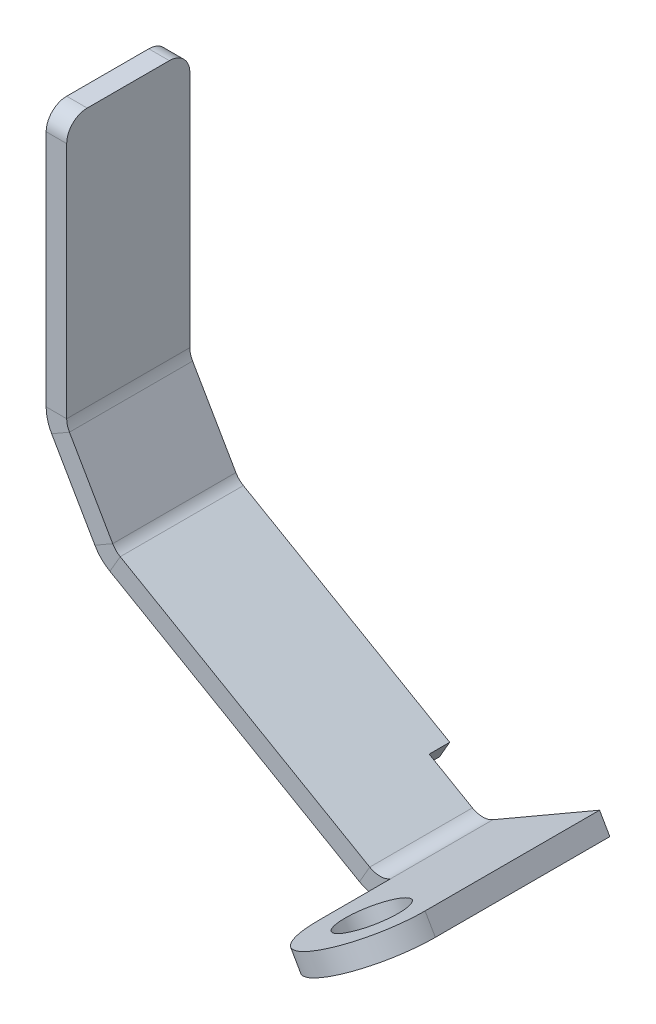
ISO-10303-21;
HEADER;
FILE_DESCRIPTION(('STEP AP214'),'2;1');
FILE_NAME('part.step','',(''),(''),'','','');
FILE_SCHEMA(('AUTOMOTIVE_DESIGN { 1 0 10303 214 1 1 1 1 }'));
ENDSEC;
DATA;
#1=APPLICATION_CONTEXT('core data for automotive mechanical design processes');
#2=APPLICATION_PROTOCOL_DEFINITION('international standard','automotive_design',2000,#1);
#3=PRODUCT_CONTEXT('',#1,'mechanical');
#4=PRODUCT('Part','Part','',(#3));
#5=PRODUCT_RELATED_PRODUCT_CATEGORY('part','',(#4));
#6=PRODUCT_DEFINITION_FORMATION('','',#4);
#7=PRODUCT_DEFINITION_CONTEXT('part definition',#1,'design');
#8=PRODUCT_DEFINITION('design','',#6,#7);
#9=PRODUCT_DEFINITION_SHAPE('','',#8);
#10=(LENGTH_UNIT() NAMED_UNIT(*) SI_UNIT(.MILLI.,.METRE.));
#11=(NAMED_UNIT(*) PLANE_ANGLE_UNIT() SI_UNIT($,.RADIAN.));
#12=(NAMED_UNIT(*) SI_UNIT($,.STERADIAN.) SOLID_ANGLE_UNIT());
#13=UNCERTAINTY_MEASURE_WITH_UNIT(LENGTH_MEASURE(1.E-05),#10,'distance_accuracy_value','');
#14=(GEOMETRIC_REPRESENTATION_CONTEXT(3) GLOBAL_UNCERTAINTY_ASSIGNED_CONTEXT((#13)) GLOBAL_UNIT_ASSIGNED_CONTEXT((#10,
#11,#12)) REPRESENTATION_CONTEXT('',''));
#15=CARTESIAN_POINT('',(0.,0.,0.));
#16=DIRECTION('',(0.,0.,1.));
#17=DIRECTION('',(1.,0.,0.));
#18=AXIS2_PLACEMENT_3D('',#15,#16,#17);
#19=CARTESIAN_POINT('',(0.462499551221927,17.4022268919688,0.999999999999999));
#20=DIRECTION('',(0.,0.,1.));
#21=DIRECTION('',(-0.866025403784438,0.500000000000001,0.));
#22=AXIS2_PLACEMENT_3D('',#19,#20,#21);
#23=PLANE('',#22);
#24=DIRECTION('',(0.866025403784438,-0.500000000000001,0.));
#25=VECTOR('',#24,1.);
#26=CARTESIAN_POINT('',(-0.037500448778074,16.5362014881843,0.999999999999999));
#27=LINE('',#26,#25);
#28=CARTESIAN_POINT('',(12.5198679060963,9.28620148818432,1.));
#29=VERTEX_POINT('',#28);
#30=CARTESIAN_POINT('',(14.6236199980584,8.07159965158177,1.));
#31=VERTEX_POINT('',#30);
#32=EDGE_CURVE('E239',#29,#31,#27,.T.);
#33=ORIENTED_EDGE('',*,*,#32,.F.);
#34=DIRECTION('',(-0.500000000000001,-0.866025403784438,0.));
#35=VECTOR('',#34,1.);
#36=CARTESIAN_POINT('',(13.0198679060963,10.1522268919688,1.));
#37=LINE('',#36,#35);
#38=CARTESIAN_POINT('',(13.0198679060963,10.1522268919688,1.));
#39=VERTEX_POINT('',#38);
#40=EDGE_CURVE('E223',#39,#29,#37,.T.);
#41=ORIENTED_EDGE('',*,*,#40,.F.);
#42=DIRECTION('',(0.866025403784438,-0.500000000000001,0.));
#43=VECTOR('',#42,1.);
#44=CARTESIAN_POINT('',(0.462499551221927,17.4022268919688,0.999999999999999));
#45=LINE('',#44,#43);
#46=CARTESIAN_POINT('',(15.1236199980584,8.93762505536621,0.999999999999999));
#47=VERTEX_POINT('',#46);
#48=EDGE_CURVE('E51',#39,#47,#45,.T.);
#49=ORIENTED_EDGE('',*,*,#48,.T.);
#50=DIRECTION('',(0.500000000000001,0.866025403784438,0.));
#51=VECTOR('',#50,1.);
#52=CARTESIAN_POINT('',(15.1236199980584,8.93762505536621,1.));
#53=LINE('',#52,#51);
#54=EDGE_CURVE('E213',#31,#47,#53,.T.);
#55=ORIENTED_EDGE('',*,*,#54,.F.);
#56=EDGE_LOOP('',(#33,#41,#49,#55));
#57=FACE_BOUND('',#56,.T.);
#58=ADVANCED_FACE('F47',(#57),#23,.F.);
#59=CARTESIAN_POINT('',(-0.037500448778074,16.5362014881843,0.));
#60=DIRECTION('',(0.500000000000001,0.866025403784438,0.));
#61=DIRECTION('',(0.,0.,-1.));
#62=AXIS2_PLACEMENT_3D('',#59,#60,#61);
#63=PLANE('',#62);
#64=DIRECTION('',(0.866025403784438,-0.500000000000001,0.));
#65=VECTOR('',#64,1.);
#66=CARTESIAN_POINT('',(-0.037500448778074,16.5362014881843,6.));
#67=LINE('',#66,#65);
#68=CARTESIAN_POINT('',(2.46765044147694,15.089851947335,6.));
#69=VERTEX_POINT('',#68);
#70=CARTESIAN_POINT('',(14.6236199980584,8.07159965158177,6.));
#71=VERTEX_POINT('',#70);
#72=EDGE_CURVE('E348',#69,#71,#67,.T.);
#73=ORIENTED_EDGE('',*,*,#72,.F.);
#74=DIRECTION('',(0.,0.,1.));
#75=VECTOR('',#74,1.);
#76=CARTESIAN_POINT('',(2.46765044147694,15.089851947335,0.));
#77=LINE('',#76,#75);
#78=CARTESIAN_POINT('',(2.46765044147694,15.089851947335,0.));
#79=VERTEX_POINT('',#78);
#80=EDGE_CURVE('E350',#79,#69,#77,.T.);
#81=ORIENTED_EDGE('',*,*,#80,.F.);
#82=DIRECTION('',(0.866025403784438,-0.500000000000001,0.));
#83=VECTOR('',#82,1.);
#84=CARTESIAN_POINT('',(-0.037500448778074,16.5362014881843,0.));
#85=LINE('',#84,#83);
#86=CARTESIAN_POINT('',(12.5198679060963,9.28620148818432,0.));
#87=VERTEX_POINT('',#86);
#88=EDGE_CURVE('E227',#79,#87,#85,.T.);
#89=ORIENTED_EDGE('',*,*,#88,.T.);
#90=DIRECTION('',(0.,0.,-1.));
#91=VECTOR('',#90,1.);
#92=CARTESIAN_POINT('',(12.5198679060963,9.28620148818432,0.));
#93=LINE('',#92,#91);
#94=EDGE_CURVE('E347',#29,#87,#93,.T.);
#95=ORIENTED_EDGE('',*,*,#94,.F.);
#96=ORIENTED_EDGE('',*,*,#32,.T.);
#97=DIRECTION('',(0.,0.,-1.));
#98=VECTOR('',#97,1.);
#99=CARTESIAN_POINT('',(14.6236199980584,8.07159965158177,0.));
#100=LINE('',#99,#98);
#101=EDGE_CURVE('E56',#71,#31,#100,.T.);
#102=ORIENTED_EDGE('',*,*,#101,.F.);
#103=EDGE_LOOP('',(#73,#81,#89,#95,#96,#102));
#104=FACE_BOUND('',#103,.T.);
#105=ADVANCED_FACE('F354',(#104),#63,.F.);
#106=CARTESIAN_POINT('',(1.54797457854187,18.146878883571,6.));
#107=DIRECTION('',(0.,0.,1.));
#108=DIRECTION('',(-0.499999999999998,0.86602540378444,0.));
#109=AXIS2_PLACEMENT_3D('',#106,#107,#108);
#110=PLANE('',#109);
#111=DIRECTION('',(0.499999999999998,-0.86602540378444,0.));
#112=VECTOR('',#111,1.);
#113=CARTESIAN_POINT('',(1.54797457854187,18.146878883571,6.));
#114=LINE('',#113,#112);
#115=CARTESIAN_POINT('',(0.494324119391233,19.9718550122382,6.));
#116=VERTEX_POINT('',#115);
#117=CARTESIAN_POINT('',(2.6016250376925,16.3219027549039,6.));
#118=VERTEX_POINT('',#117);
#119=EDGE_CURVE('E315',#116,#118,#114,.T.);
#120=ORIENTED_EDGE('',*,*,#119,.F.);
#121=DIRECTION('',(-0.86602540378444,-0.499999999999998,0.));
#122=VECTOR('',#121,1.);
#123=CARTESIAN_POINT('',(0.494324119391233,19.9718550122382,6.));
#124=LINE('',#123,#122);
#125=CARTESIAN_POINT('',(-0.371701284393207,19.4718550122382,6.));
#126=VERTEX_POINT('',#125);
#127=EDGE_CURVE('E314',#116,#126,#124,.T.);
#128=ORIENTED_EDGE('',*,*,#127,.T.);
#129=DIRECTION('',(0.499999999999998,-0.86602540378444,0.));
#130=VECTOR('',#129,1.);
#131=CARTESIAN_POINT('',(0.681949174757427,17.646878883571,6.));
#132=LINE('',#131,#130);
#133=CARTESIAN_POINT('',(1.73559963390806,15.8219027549039,6.));
#134=VERTEX_POINT('',#133);
#135=EDGE_CURVE('E338',#126,#134,#132,.T.);
#136=ORIENTED_EDGE('',*,*,#135,.T.);
#137=DIRECTION('',(-0.86602540378444,-0.499999999999998,0.));
#138=VECTOR('',#137,1.);
#139=CARTESIAN_POINT('',(2.6016250376925,16.3219027549039,6.));
#140=LINE('',#139,#138);
#141=EDGE_CURVE('E214',#118,#134,#140,.T.);
#142=ORIENTED_EDGE('',*,*,#141,.F.);
#143=EDGE_LOOP('',(#120,#128,#136,#142));
#144=FACE_BOUND('',#143,.T.);
#145=ADVANCED_FACE('F394',(#144),#110,.T.);
#146=CARTESIAN_POINT('',(1.54797457854187,18.146878883571,0.));
#147=DIRECTION('',(0.86602540378444,0.499999999999998,0.));
#148=DIRECTION('',(0.,0.,-1.));
#149=AXIS2_PLACEMENT_3D('',#146,#147,#148);
#150=PLANE('',#149);
#151=DIRECTION('',(0.499999999999998,-0.86602540378444,0.));
#152=VECTOR('',#151,1.);
#153=CARTESIAN_POINT('',(1.54797457854187,18.146878883571,0.));
#154=LINE('',#153,#152);
#155=CARTESIAN_POINT('',(0.494324119391233,19.9718550122382,0.));
#156=VERTEX_POINT('',#155);
#157=CARTESIAN_POINT('',(2.6016250376925,16.3219027549039,0.));
#158=VERTEX_POINT('',#157);
#159=EDGE_CURVE('E337',#156,#158,#154,.T.);
#160=ORIENTED_EDGE('',*,*,#159,.F.);
#161=DIRECTION('',(0.,0.,1.));
#162=VECTOR('',#161,1.);
#163=CARTESIAN_POINT('',(0.494324119391233,19.9718550122382,0.));
#164=LINE('',#163,#162);
#165=EDGE_CURVE('E311',#156,#116,#164,.T.);
#166=ORIENTED_EDGE('',*,*,#165,.T.);
#167=ORIENTED_EDGE('',*,*,#119,.T.);
#168=DIRECTION('',(0.,0.,1.));
#169=VECTOR('',#168,1.);
#170=CARTESIAN_POINT('',(2.6016250376925,16.3219027549039,0.));
#171=LINE('',#170,#169);
#172=EDGE_CURVE('E324',#158,#118,#171,.T.);
#173=ORIENTED_EDGE('',*,*,#172,.F.);
#174=EDGE_LOOP('',(#160,#166,#167,#173));
#175=FACE_BOUND('',#174,.T.);
#176=ADVANCED_FACE('F377',(#175),#150,.T.);
#177=CARTESIAN_POINT('',(0.681949174757427,17.646878883571,0.));
#178=DIRECTION('',(0.86602540378444,0.499999999999998,0.));
#179=DIRECTION('',(0.,0.,-1.));
#180=AXIS2_PLACEMENT_3D('',#177,#178,#179);
#181=PLANE('',#180);
#182=DIRECTION('',(0.,0.,1.));
#183=VECTOR('',#182,1.);
#184=CARTESIAN_POINT('',(1.73559963390806,15.8219027549039,0.));
#185=LINE('',#184,#183);
#186=CARTESIAN_POINT('',(1.73559963390806,15.8219027549039,0.));
#187=VERTEX_POINT('',#186);
#188=EDGE_CURVE('E330',#187,#134,#185,.T.);
#189=ORIENTED_EDGE('',*,*,#188,.T.);
#190=ORIENTED_EDGE('',*,*,#135,.F.);
#191=DIRECTION('',(0.,0.,1.));
#192=VECTOR('',#191,1.);
#193=CARTESIAN_POINT('',(-0.371701284393207,19.4718550122382,0.));
#194=LINE('',#193,#192);
#195=CARTESIAN_POINT('',(-0.371701284393207,19.4718550122382,0.));
#196=VERTEX_POINT('',#195);
#197=EDGE_CURVE('E318',#196,#126,#194,.T.);
#198=ORIENTED_EDGE('',*,*,#197,.F.);
#199=DIRECTION('',(0.499999999999998,-0.86602540378444,0.));
#200=VECTOR('',#199,1.);
#201=CARTESIAN_POINT('',(0.681949174757427,17.646878883571,0.));
#202=LINE('',#201,#200);
#203=EDGE_CURVE('E307',#196,#187,#202,.T.);
#204=ORIENTED_EDGE('',*,*,#203,.T.);
#205=EDGE_LOOP('',(#189,#190,#198,#204));
#206=FACE_BOUND('',#205,.T.);
#207=ADVANCED_FACE('F452',(#206),#181,.F.);
#208=CARTESIAN_POINT('',(1.54797457854187,18.146878883571,0.));
#209=DIRECTION('',(0.,0.,1.));
#210=DIRECTION('',(-0.499999999999998,0.86602540378444,0.));
#211=AXIS2_PLACEMENT_3D('',#208,#209,#210);
#212=PLANE('',#211);
#213=DIRECTION('',(-0.86602540378444,-0.499999999999998,0.));
#214=VECTOR('',#213,1.);
#215=CARTESIAN_POINT('',(2.6016250376925,16.3219027549039,0.));
#216=LINE('',#215,#214);
#217=EDGE_CURVE('E327',#158,#187,#216,.T.);
#218=ORIENTED_EDGE('',*,*,#217,.T.);
#219=ORIENTED_EDGE('',*,*,#203,.F.);
#220=DIRECTION('',(-0.86602540378444,-0.499999999999998,0.));
#221=VECTOR('',#220,1.);
#222=CARTESIAN_POINT('',(0.494324119391233,19.9718550122382,0.));
#223=LINE('',#222,#221);
#224=EDGE_CURVE('E321',#156,#196,#223,.T.);
#225=ORIENTED_EDGE('',*,*,#224,.F.);
#226=ORIENTED_EDGE('',*,*,#159,.T.);
#227=EDGE_LOOP('',(#218,#219,#225,#226));
#228=FACE_BOUND('',#227,.T.);
#229=ADVANCED_FACE('F381',(#228),#212,.F.);
#230=CARTESIAN_POINT('',(1.36034952317567,20.4718550122382,0.));
#231=DIRECTION('',(0.,0.,1.));
#232=DIRECTION('',(-0.499999999999998,0.86602540378444,0.));
#233=AXIS2_PLACEMENT_3D('',#230,#231,#232);
#234=PLANE('',#233);
#235=DIRECTION('',(-1.,0.,0.));
#236=VECTOR('',#235,1.);
#237=CARTESIAN_POINT('',(0.360349523175673,20.4718550122382,0.));
#238=LINE('',#237,#236);
#239=CARTESIAN_POINT('',(0.360349523175673,20.4718550122382,0.));
#240=VERTEX_POINT('',#239);
#241=CARTESIAN_POINT('',(-0.639650476824327,20.4718550122382,0.));
#242=VERTEX_POINT('',#241);
#243=EDGE_CURVE('E251',#240,#242,#238,.T.);
#244=ORIENTED_EDGE('',*,*,#243,.F.);
#245=CARTESIAN_POINT('',(1.36034952317567,20.4718550122382,0.));
#246=DIRECTION('',(0.,0.,1.));
#247=DIRECTION('',(0.499999999999998,-0.86602540378444,0.));
#248=AXIS2_PLACEMENT_3D('',#245,#246,#247);
#249=CIRCLE('',#248,1.);
#250=EDGE_CURVE('E301',#240,#156,#249,.T.);
#251=ORIENTED_EDGE('',*,*,#250,.T.);
#252=ORIENTED_EDGE('',*,*,#224,.T.);
#253=CARTESIAN_POINT('',(1.36034952317567,20.4718550122382,0.));
#254=DIRECTION('',(0.,0.,1.));
#255=DIRECTION('',(0.499999999999998,-0.86602540378444,0.));
#256=AXIS2_PLACEMENT_3D('',#253,#254,#255);
#257=CIRCLE('',#256,2.);
#258=EDGE_CURVE('E257',#242,#196,#257,.T.);
#259=ORIENTED_EDGE('',*,*,#258,.F.);
#260=EDGE_LOOP('',(#244,#251,#252,#259));
#261=FACE_BOUND('',#260,.T.);
#262=ADVANCED_FACE('F456',(#261),#234,.F.);
#263=CARTESIAN_POINT('',(1.36034952317567,20.4718550122382,6.));
#264=DIRECTION('',(0.,0.,-1.));
#265=DIRECTION('',(0.499999999999998,-0.86602540378444,0.));
#266=AXIS2_PLACEMENT_3D('',#263,#264,#265);
#267=PLANE('',#266);
#268=CARTESIAN_POINT('',(1.36034952317567,20.4718550122382,6.));
#269=DIRECTION('',(0.,0.,1.));
#270=DIRECTION('',(0.499999999999998,-0.86602540378444,0.));
#271=AXIS2_PLACEMENT_3D('',#268,#269,#270);
#272=CIRCLE('',#271,2.);
#273=CARTESIAN_POINT('',(-0.639650476824327,20.4718550122382,6.));
#274=VERTEX_POINT('',#273);
#275=EDGE_CURVE('E304',#126,#274,#272,.F.);
#276=ORIENTED_EDGE('',*,*,#275,.F.);
#277=ORIENTED_EDGE('',*,*,#127,.F.);
#278=CARTESIAN_POINT('',(1.36034952317567,20.4718550122382,6.));
#279=DIRECTION('',(0.,0.,-1.));
#280=DIRECTION('',(0.499999999999998,-0.86602540378444,0.));
#281=AXIS2_PLACEMENT_3D('',#278,#279,#280);
#282=CIRCLE('',#281,1.);
#283=CARTESIAN_POINT('',(0.360349523175673,20.4718550122382,6.));
#284=VERTEX_POINT('',#283);
#285=EDGE_CURVE('E303',#116,#284,#282,.T.);
#286=ORIENTED_EDGE('',*,*,#285,.T.);
#287=DIRECTION('',(-1.,0.,0.));
#288=VECTOR('',#287,1.);
#289=CARTESIAN_POINT('',(0.360349523175673,20.4718550122382,6.));
#290=LINE('',#289,#288);
#291=EDGE_CURVE('E263',#284,#274,#290,.T.);
#292=ORIENTED_EDGE('',*,*,#291,.T.);
#293=EDGE_LOOP('',(#276,#277,#286,#292));
#294=FACE_BOUND('',#293,.T.);
#295=ADVANCED_FACE('F392',(#294),#267,.F.);
#296=CARTESIAN_POINT('',(1.36034952317567,20.4718550122382,9.13325772123332));
#297=DIRECTION('',(0.,0.,-1.));
#298=DIRECTION('',(0.499999999999998,-0.86602540378444,0.));
#299=AXIS2_PLACEMENT_3D('',#296,#297,#298);
#300=CYLINDRICAL_SURFACE('',#299,1.);
#301=ORIENTED_EDGE('',*,*,#165,.F.);
#302=ORIENTED_EDGE('',*,*,#250,.F.);
#303=DIRECTION('',(0.,0.,1.));
#304=VECTOR('',#303,1.);
#305=CARTESIAN_POINT('',(0.360349523175673,20.4718550122382,0.));
#306=LINE('',#305,#304);
#307=EDGE_CURVE('E275',#240,#284,#306,.T.);
#308=ORIENTED_EDGE('',*,*,#307,.T.);
#309=ORIENTED_EDGE('',*,*,#285,.F.);
#310=EDGE_LOOP('',(#301,#302,#308,#309));
#311=FACE_BOUND('',#310,.T.);
#312=ADVANCED_FACE('F388',(#311),#300,.F.);
#313=CARTESIAN_POINT('',(1.36034952317567,20.4718550122382,9.13325772123332));
#314=DIRECTION('',(0.,0.,-1.));
#315=DIRECTION('',(0.499999999999998,-0.86602540378444,0.));
#316=AXIS2_PLACEMENT_3D('',#313,#314,#315);
#317=CYLINDRICAL_SURFACE('',#316,2.);
#318=ORIENTED_EDGE('',*,*,#197,.T.);
#319=ORIENTED_EDGE('',*,*,#275,.T.);
#320=DIRECTION('',(0.,0.,1.));
#321=VECTOR('',#320,1.);
#322=CARTESIAN_POINT('',(-0.639650476824327,20.4718550122382,0.));
#323=LINE('',#322,#321);
#324=EDGE_CURVE('E296',#242,#274,#323,.T.);
#325=ORIENTED_EDGE('',*,*,#324,.F.);
#326=ORIENTED_EDGE('',*,*,#258,.T.);
#327=EDGE_LOOP('',(#318,#319,#325,#326));
#328=FACE_BOUND('',#327,.T.);
#329=ADVANCED_FACE('F454',(#328),#317,.T.);
#330=CARTESIAN_POINT('',(0.360349523175713,32.0791559305395,1.));
#331=DIRECTION('',(-1.,0.,0.));
#332=DIRECTION('',(0.,0.,1.));
#333=AXIS2_PLACEMENT_3D('',#330,#331,#332);
#334=CYLINDRICAL_SURFACE('',#333,1.);
#335=CARTESIAN_POINT('',(-0.639650476824287,32.0791559305395,1.));
#336=DIRECTION('',(-1.,0.,0.));
#337=DIRECTION('',(0.,0.,-1.));
#338=AXIS2_PLACEMENT_3D('',#335,#336,#337);
#339=CIRCLE('',#338,1.);
#340=CARTESIAN_POINT('',(-0.639650476824283,33.0791559305395,1.));
#341=VERTEX_POINT('',#340);
#342=CARTESIAN_POINT('',(-0.639650476824287,32.0791559305395,0.));
#343=VERTEX_POINT('',#342);
#344=EDGE_CURVE('E293',#341,#343,#339,.T.);
#345=ORIENTED_EDGE('',*,*,#344,.F.);
#346=DIRECTION('',(-1.,0.,0.));
#347=VECTOR('',#346,1.);
#348=CARTESIAN_POINT('',(0.360349523175717,33.0791559305395,1.));
#349=LINE('',#348,#347);
#350=CARTESIAN_POINT('',(0.360349523175717,33.0791559305395,1.));
#351=VERTEX_POINT('',#350);
#352=EDGE_CURVE('E290',#351,#341,#349,.T.);
#353=ORIENTED_EDGE('',*,*,#352,.F.);
#354=CARTESIAN_POINT('',(0.360349523175713,32.0791559305395,1.));
#355=DIRECTION('',(-1.,0.,0.));
#356=DIRECTION('',(0.,0.,-1.));
#357=AXIS2_PLACEMENT_3D('',#354,#355,#356);
#358=CIRCLE('',#357,1.);
#359=CARTESIAN_POINT('',(0.360349523175713,32.0791559305395,0.));
#360=VERTEX_POINT('',#359);
#361=EDGE_CURVE('E268',#351,#360,#358,.T.);
#362=ORIENTED_EDGE('',*,*,#361,.T.);
#363=DIRECTION('',(-1.,0.,0.));
#364=VECTOR('',#363,1.);
#365=CARTESIAN_POINT('',(0.360349523175713,32.0791559305395,0.));
#366=LINE('',#365,#364);
#367=EDGE_CURVE('E258',#360,#343,#366,.T.);
#368=ORIENTED_EDGE('',*,*,#367,.T.);
#369=EDGE_LOOP('',(#345,#353,#362,#368));
#370=FACE_BOUND('',#369,.T.);
#371=ADVANCED_FACE('F476',(#370),#334,.T.);
#372=CARTESIAN_POINT('',(0.360349523175717,33.0791559305395,0.));
#373=DIRECTION('',(0.,-1.,0.));
#374=DIRECTION('',(0.,0.,1.));
#375=AXIS2_PLACEMENT_3D('',#372,#373,#374);
#376=PLANE('',#375);
#377=DIRECTION('',(0.,0.,-1.));
#378=VECTOR('',#377,1.);
#379=CARTESIAN_POINT('',(-0.639650476824283,33.0791559305395,0.));
#380=LINE('',#379,#378);
#381=CARTESIAN_POINT('',(-0.639650476824283,33.0791559305395,5.));
#382=VERTEX_POINT('',#381);
#383=EDGE_CURVE('E288',#382,#341,#380,.T.);
#384=ORIENTED_EDGE('',*,*,#383,.F.);
#385=DIRECTION('',(-1.,0.,0.));
#386=VECTOR('',#385,1.);
#387=CARTESIAN_POINT('',(0.360349523175717,33.0791559305395,5.));
#388=LINE('',#387,#386);
#389=CARTESIAN_POINT('',(0.360349523175717,33.0791559305395,5.));
#390=VERTEX_POINT('',#389);
#391=EDGE_CURVE('E285',#390,#382,#388,.T.);
#392=ORIENTED_EDGE('',*,*,#391,.F.);
#393=DIRECTION('',(0.,0.,-1.));
#394=VECTOR('',#393,1.);
#395=CARTESIAN_POINT('',(0.360349523175717,33.0791559305395,0.));
#396=LINE('',#395,#394);
#397=EDGE_CURVE('E271',#390,#351,#396,.T.);
#398=ORIENTED_EDGE('',*,*,#397,.T.);
#399=ORIENTED_EDGE('',*,*,#352,.T.);
#400=EDGE_LOOP('',(#384,#392,#398,#399));
#401=FACE_BOUND('',#400,.T.);
#402=ADVANCED_FACE('F480',(#401),#376,.F.);
#403=CARTESIAN_POINT('',(0.360349523175713,32.0791559305395,5.));
#404=DIRECTION('',(-1.,0.,0.));
#405=DIRECTION('',(0.,0.,1.));
#406=AXIS2_PLACEMENT_3D('',#403,#404,#405);
#407=CYLINDRICAL_SURFACE('',#406,1.);
#408=CARTESIAN_POINT('',(-0.639650476824287,32.0791559305395,5.));
#409=DIRECTION('',(-1.,0.,0.));
#410=DIRECTION('',(0.,0.,-1.));
#411=AXIS2_PLACEMENT_3D('',#408,#409,#410);
#412=CIRCLE('',#411,1.);
#413=CARTESIAN_POINT('',(-0.639650476824287,32.0791559305395,6.));
#414=VERTEX_POINT('',#413);
#415=EDGE_CURVE('E283',#414,#382,#412,.T.);
#416=ORIENTED_EDGE('',*,*,#415,.F.);
#417=DIRECTION('',(-1.,0.,0.));
#418=VECTOR('',#417,1.);
#419=CARTESIAN_POINT('',(0.360349523175713,32.0791559305395,6.));
#420=LINE('',#419,#418);
#421=CARTESIAN_POINT('',(0.360349523175713,32.0791559305395,6.));
#422=VERTEX_POINT('',#421);
#423=EDGE_CURVE('E280',#422,#414,#420,.T.);
#424=ORIENTED_EDGE('',*,*,#423,.F.);
#425=CARTESIAN_POINT('',(0.360349523175713,32.0791559305395,5.));
#426=DIRECTION('',(-1.,0.,0.));
#427=DIRECTION('',(0.,0.,-1.));
#428=AXIS2_PLACEMENT_3D('',#425,#426,#427);
#429=CIRCLE('',#428,1.);
#430=EDGE_CURVE('E273',#422,#390,#429,.T.);
#431=ORIENTED_EDGE('',*,*,#430,.T.);
#432=ORIENTED_EDGE('',*,*,#391,.T.);
#433=EDGE_LOOP('',(#416,#424,#431,#432));
#434=FACE_BOUND('',#433,.T.);
#435=ADVANCED_FACE('F482',(#434),#407,.T.);
#436=CARTESIAN_POINT('',(0.360349523175663,17.5791559305395,0.));
#437=DIRECTION('',(1.,0.,0.));
#438=DIRECTION('',(0.,0.,-1.));
#439=AXIS2_PLACEMENT_3D('',#436,#437,#438);
#440=PLANE('',#439);
#441=DIRECTION('',(0.,-1.,0.));
#442=VECTOR('',#441,1.);
#443=CARTESIAN_POINT('',(0.360349523175663,17.5791559305395,0.));
#444=LINE('',#443,#442);
#445=EDGE_CURVE('E278',#360,#240,#444,.T.);
#446=ORIENTED_EDGE('',*,*,#445,.F.);
#447=ORIENTED_EDGE('',*,*,#361,.F.);
#448=ORIENTED_EDGE('',*,*,#397,.F.);
#449=ORIENTED_EDGE('',*,*,#430,.F.);
#450=DIRECTION('',(0.,-1.,0.));
#451=VECTOR('',#450,1.);
#452=CARTESIAN_POINT('',(0.360349523175663,17.5791559305395,6.));
#453=LINE('',#452,#451);
#454=EDGE_CURVE('E266',#422,#284,#453,.T.);
#455=ORIENTED_EDGE('',*,*,#454,.T.);
#456=ORIENTED_EDGE('',*,*,#307,.F.);
#457=EDGE_LOOP('',(#446,#447,#448,#449,#455,#456));
#458=FACE_BOUND('',#457,.T.);
#459=ADVANCED_FACE('F463',(#458),#440,.T.);
#460=CARTESIAN_POINT('',(0.360349523175663,17.5791559305395,6.));
#461=DIRECTION('',(0.,0.,1.));
#462=DIRECTION('',(0.,1.,0.));
#463=AXIS2_PLACEMENT_3D('',#460,#461,#462);
#464=PLANE('',#463);
#465=ORIENTED_EDGE('',*,*,#454,.F.);
#466=ORIENTED_EDGE('',*,*,#423,.T.);
#467=DIRECTION('',(0.,-1.,0.));
#468=VECTOR('',#467,1.);
#469=CARTESIAN_POINT('',(-0.639650476824337,17.5791559305395,6.));
#470=LINE('',#469,#468);
#471=EDGE_CURVE('E261',#414,#274,#470,.T.);
#472=ORIENTED_EDGE('',*,*,#471,.T.);
#473=ORIENTED_EDGE('',*,*,#291,.F.);
#474=EDGE_LOOP('',(#465,#466,#472,#473));
#475=FACE_BOUND('',#474,.T.);
#476=ADVANCED_FACE('F467',(#475),#464,.T.);
#477=CARTESIAN_POINT('',(-0.639650476824337,17.5791559305395,0.));
#478=DIRECTION('',(1.,0.,0.));
#479=DIRECTION('',(0.,0.,-1.));
#480=AXIS2_PLACEMENT_3D('',#477,#478,#479);
#481=PLANE('',#480);
#482=ORIENTED_EDGE('',*,*,#324,.T.);
#483=ORIENTED_EDGE('',*,*,#471,.F.);
#484=ORIENTED_EDGE('',*,*,#415,.T.);
#485=ORIENTED_EDGE('',*,*,#383,.T.);
#486=ORIENTED_EDGE('',*,*,#344,.T.);
#487=DIRECTION('',(0.,-1.,0.));
#488=VECTOR('',#487,1.);
#489=CARTESIAN_POINT('',(-0.639650476824337,17.5791559305395,0.));
#490=LINE('',#489,#488);
#491=EDGE_CURVE('E255',#343,#242,#490,.T.);
#492=ORIENTED_EDGE('',*,*,#491,.T.);
#493=EDGE_LOOP('',(#482,#483,#484,#485,#486,#492));
#494=FACE_BOUND('',#493,.T.);
#495=ADVANCED_FACE('F471',(#494),#481,.F.);
#496=CARTESIAN_POINT('',(0.360349523175663,17.5791559305395,0.));
#497=DIRECTION('',(0.,0.,1.));
#498=DIRECTION('',(0.,1.,0.));
#499=AXIS2_PLACEMENT_3D('',#496,#497,#498);
#500=PLANE('',#499);
#501=ORIENTED_EDGE('',*,*,#243,.T.);
#502=ORIENTED_EDGE('',*,*,#491,.F.);
#503=ORIENTED_EDGE('',*,*,#367,.F.);
#504=ORIENTED_EDGE('',*,*,#445,.T.);
#505=EDGE_LOOP('',(#501,#502,#503,#504));
#506=FACE_BOUND('',#505,.T.);
#507=ADVANCED_FACE('F458',(#506),#500,.F.);
#508=CARTESIAN_POINT('',(3.46765044147694,16.8219027549038,0.));
#509=DIRECTION('',(0.,0.,1.));
#510=DIRECTION('',(-0.499999999999998,0.86602540378444,0.));
#511=AXIS2_PLACEMENT_3D('',#508,#509,#510);
#512=PLANE('',#511);
#513=ORIENTED_EDGE('',*,*,#217,.F.);
#514=CARTESIAN_POINT('',(3.46765044147694,16.8219027549038,0.));
#515=DIRECTION('',(0.,0.,1.));
#516=DIRECTION('',(0.499999999999998,-0.86602540378444,0.));
#517=AXIS2_PLACEMENT_3D('',#514,#515,#516);
#518=CIRCLE('',#517,1.);
#519=CARTESIAN_POINT('',(2.96765044147694,15.9558773511194,0.));
#520=VERTEX_POINT('',#519);
#521=EDGE_CURVE('E245',#158,#520,#518,.T.);
#522=ORIENTED_EDGE('',*,*,#521,.T.);
#523=DIRECTION('',(-0.500000000000001,-0.866025403784438,0.));
#524=VECTOR('',#523,1.);
#525=CARTESIAN_POINT('',(2.96765044147694,15.9558773511194,0.));
#526=LINE('',#525,#524);
#527=EDGE_CURVE('E224',#520,#79,#526,.T.);
#528=ORIENTED_EDGE('',*,*,#527,.T.);
#529=CARTESIAN_POINT('',(3.46765044147694,16.8219027549038,0.));
#530=DIRECTION('',(0.,0.,-1.));
#531=DIRECTION('',(-0.499999999999998,0.86602540378444,0.));
#532=AXIS2_PLACEMENT_3D('',#529,#530,#531);
#533=CIRCLE('',#532,2.);
#534=EDGE_CURVE('E252',#187,#79,#533,.F.);
#535=ORIENTED_EDGE('',*,*,#534,.F.);
#536=EDGE_LOOP('',(#513,#522,#528,#535));
#537=FACE_BOUND('',#536,.T.);
#538=ADVANCED_FACE('F371',(#537),#512,.F.);
#539=CARTESIAN_POINT('',(3.46765044147694,16.8219027549038,6.));
#540=DIRECTION('',(0.,0.,-1.));
#541=DIRECTION('',(0.499999999999998,-0.86602540378444,0.));
#542=AXIS2_PLACEMENT_3D('',#539,#540,#541);
#543=PLANE('',#542);
#544=CARTESIAN_POINT('',(3.46765044147694,16.8219027549038,6.));
#545=DIRECTION('',(0.,0.,-1.));
#546=DIRECTION('',(-0.499999999999998,0.86602540378444,0.));
#547=AXIS2_PLACEMENT_3D('',#544,#545,#546);
#548=CIRCLE('',#547,2.);
#549=EDGE_CURVE('E249',#69,#134,#548,.T.);
#550=ORIENTED_EDGE('',*,*,#549,.F.);
#551=DIRECTION('',(-0.500000000000001,-0.866025403784438,0.));
#552=VECTOR('',#551,1.);
#553=CARTESIAN_POINT('',(2.96765044147694,15.9558773511194,6.));
#554=LINE('',#553,#552);
#555=CARTESIAN_POINT('',(2.96765044147694,15.9558773511194,6.));
#556=VERTEX_POINT('',#555);
#557=EDGE_CURVE('E240',#556,#69,#554,.T.);
#558=ORIENTED_EDGE('',*,*,#557,.F.);
#559=CARTESIAN_POINT('',(3.46765044147694,16.8219027549038,6.));
#560=DIRECTION('',(0.,0.,-1.));
#561=DIRECTION('',(0.499999999999998,-0.86602540378444,0.));
#562=AXIS2_PLACEMENT_3D('',#559,#560,#561);
#563=CIRCLE('',#562,1.);
#564=EDGE_CURVE('E248',#556,#118,#563,.T.);
#565=ORIENTED_EDGE('',*,*,#564,.T.);
#566=ORIENTED_EDGE('',*,*,#141,.T.);
#567=EDGE_LOOP('',(#550,#558,#565,#566));
#568=FACE_BOUND('',#567,.T.);
#569=ADVANCED_FACE('F398',(#568),#543,.F.);
#570=CARTESIAN_POINT('',(3.46765044147694,16.8219027549038,-3.13325772123332));
#571=DIRECTION('',(0.,0.,1.));
#572=DIRECTION('',(-0.499999999999998,0.86602540378444,0.));
#573=AXIS2_PLACEMENT_3D('',#570,#571,#572);
#574=CYLINDRICAL_SURFACE('',#573,1.);
#575=DIRECTION('',(0.,0.,1.));
#576=VECTOR('',#575,1.);
#577=CARTESIAN_POINT('',(2.96765044147694,15.9558773511194,0.));
#578=LINE('',#577,#576);
#579=EDGE_CURVE('E242',#520,#556,#578,.T.);
#580=ORIENTED_EDGE('',*,*,#579,.F.);
#581=ORIENTED_EDGE('',*,*,#521,.F.);
#582=ORIENTED_EDGE('',*,*,#172,.T.);
#583=ORIENTED_EDGE('',*,*,#564,.F.);
#584=EDGE_LOOP('',(#580,#581,#582,#583));
#585=FACE_BOUND('',#584,.T.);
#586=ADVANCED_FACE('F366',(#585),#574,.F.);
#587=CARTESIAN_POINT('',(3.46765044147694,16.8219027549038,-3.13325772123332));
#588=DIRECTION('',(0.,0.,1.));
#589=DIRECTION('',(-0.499999999999998,0.86602540378444,0.));
#590=AXIS2_PLACEMENT_3D('',#587,#588,#589);
#591=CYLINDRICAL_SURFACE('',#590,2.);
#592=ORIENTED_EDGE('',*,*,#80,.T.);
#593=ORIENTED_EDGE('',*,*,#549,.T.);
#594=ORIENTED_EDGE('',*,*,#188,.F.);
#595=ORIENTED_EDGE('',*,*,#534,.T.);
#596=EDGE_LOOP('',(#592,#593,#594,#595));
#597=FACE_BOUND('',#596,.T.);
#598=ADVANCED_FACE('F449',(#597),#591,.T.);
#599=CARTESIAN_POINT('',(13.0198679060963,10.1522268919688,0.));
#600=DIRECTION('',(0.866025403784438,-0.500000000000001,0.));
#601=DIRECTION('',(0.,0.,1.));
#602=AXIS2_PLACEMENT_3D('',#599,#600,#601);
#603=PLANE('',#602);
#604=ORIENTED_EDGE('',*,*,#94,.T.);
#605=DIRECTION('',(-0.500000000000001,-0.866025403784438,0.));
#606=VECTOR('',#605,1.);
#607=CARTESIAN_POINT('',(13.0198679060963,10.1522268919688,0.));
#608=LINE('',#607,#606);
#609=CARTESIAN_POINT('',(13.0198679060963,10.1522268919688,0.));
#610=VERTEX_POINT('',#609);
#611=EDGE_CURVE('E229',#610,#87,#608,.T.);
#612=ORIENTED_EDGE('',*,*,#611,.F.);
#613=DIRECTION('',(0.,0.,-1.));
#614=VECTOR('',#613,1.);
#615=CARTESIAN_POINT('',(13.0198679060963,10.1522268919688,0.));
#616=LINE('',#615,#614);
#617=EDGE_CURVE('E233',#39,#610,#616,.T.);
#618=ORIENTED_EDGE('',*,*,#617,.F.);
#619=ORIENTED_EDGE('',*,*,#40,.T.);
#620=EDGE_LOOP('',(#604,#612,#618,#619));
#621=FACE_BOUND('',#620,.T.);
#622=ADVANCED_FACE('F362',(#621),#603,.T.);
#623=CARTESIAN_POINT('',(0.462499551221927,17.4022268919688,0.));
#624=DIRECTION('',(0.500000000000001,0.866025403784438,0.));
#625=DIRECTION('',(0.,0.,-1.));
#626=AXIS2_PLACEMENT_3D('',#623,#624,#625);
#627=PLANE('',#626);
#628=DIRECTION('',(0.,0.,-1.));
#629=VECTOR('',#628,1.);
#630=CARTESIAN_POINT('',(15.1236199980584,8.93762505536621,0.));
#631=LINE('',#630,#629);
#632=CARTESIAN_POINT('',(15.1236199980584,8.93762505536621,6.));
#633=VERTEX_POINT('',#632);
#634=EDGE_CURVE('E196',#633,#47,#631,.T.);
#635=ORIENTED_EDGE('',*,*,#634,.T.);
#636=ORIENTED_EDGE('',*,*,#48,.F.);
#637=ORIENTED_EDGE('',*,*,#617,.T.);
#638=DIRECTION('',(0.866025403784438,-0.500000000000001,0.));
#639=VECTOR('',#638,1.);
#640=CARTESIAN_POINT('',(0.462499551221927,17.4022268919688,0.));
#641=LINE('',#640,#639);
#642=EDGE_CURVE('E225',#520,#610,#641,.T.);
#643=ORIENTED_EDGE('',*,*,#642,.F.);
#644=ORIENTED_EDGE('',*,*,#579,.T.);
#645=DIRECTION('',(0.866025403784438,-0.500000000000001,0.));
#646=VECTOR('',#645,1.);
#647=CARTESIAN_POINT('',(0.462499551221927,17.4022268919688,6.));
#648=LINE('',#647,#646);
#649=EDGE_CURVE('E212',#556,#633,#648,.T.);
#650=ORIENTED_EDGE('',*,*,#649,.T.);
#651=EDGE_LOOP('',(#635,#636,#637,#643,#644,#650));
#652=FACE_BOUND('',#651,.T.);
#653=ADVANCED_FACE('F207',(#652),#627,.T.);
#654=CARTESIAN_POINT('',(0.462499551221927,17.4022268919688,0.));
#655=DIRECTION('',(0.,0.,1.));
#656=DIRECTION('',(-0.866025403784438,0.500000000000001,0.));
#657=AXIS2_PLACEMENT_3D('',#654,#655,#656);
#658=PLANE('',#657);
#659=ORIENTED_EDGE('',*,*,#642,.T.);
#660=ORIENTED_EDGE('',*,*,#611,.T.);
#661=ORIENTED_EDGE('',*,*,#88,.F.);
#662=ORIENTED_EDGE('',*,*,#527,.F.);
#663=EDGE_LOOP('',(#659,#660,#661,#662));
#664=FACE_BOUND('',#663,.T.);
#665=ADVANCED_FACE('F369',(#664),#658,.F.);
#666=CARTESIAN_POINT('',(0.462499551221927,17.4022268919688,6.));
#667=DIRECTION('',(0.,0.,1.));
#668=DIRECTION('',(-0.866025403784438,0.500000000000001,0.));
#669=AXIS2_PLACEMENT_3D('',#666,#667,#668);
#670=PLANE('',#669);
#671=DIRECTION('',(0.500000000000001,0.866025403784438,0.));
#672=VECTOR('',#671,1.);
#673=CARTESIAN_POINT('',(15.1236199980584,8.93762505536621,6.));
#674=LINE('',#673,#672);
#675=EDGE_CURVE('E11',#71,#633,#674,.T.);
#676=ORIENTED_EDGE('',*,*,#675,.T.);
#677=ORIENTED_EDGE('',*,*,#649,.F.);
#678=ORIENTED_EDGE('',*,*,#557,.T.);
#679=ORIENTED_EDGE('',*,*,#72,.T.);
#680=EDGE_LOOP('',(#676,#677,#678,#679));
#681=FACE_BOUND('',#680,.T.);
#682=ADVANCED_FACE('F49',(#681),#670,.T.);
#683=CARTESIAN_POINT('',(18.7216962094117,10.4376250553662,9.5));
#684=DIRECTION('',(0.500000000000001,-0.866025403784438,0.));
#685=DIRECTION('',(0.,0.,1.));
#686=AXIS2_PLACEMENT_3D('',#683,#684,#685);
#687=CYLINDRICAL_SURFACE('',#686,3.);
#688=CARTESIAN_POINT('',(19.2216962094117,9.57159965158178,9.5));
#689=DIRECTION('',(0.500000000000001,-0.866025403784438,0.));
#690=DIRECTION('',(0.,0.,-1.));
#691=AXIS2_PLACEMENT_3D('',#688,#689,#690);
#692=CIRCLE('',#691,3.);
#693=CARTESIAN_POINT('',(21.819772420765,11.0715996515818,9.5));
#694=VERTEX_POINT('',#693);
#695=CARTESIAN_POINT('',(16.6236199980584,8.07159965158178,9.5));
#696=VERTEX_POINT('',#695);
#697=EDGE_CURVE('E439',#694,#696,#692,.T.);
#698=ORIENTED_EDGE('',*,*,#697,.F.);
#699=DIRECTION('',(0.500000000000001,-0.866025403784438,0.));
#700=VECTOR('',#699,1.);
#701=CARTESIAN_POINT('',(21.319772420765,11.9376250553662,9.5));
#702=LINE('',#701,#700);
#703=CARTESIAN_POINT('',(21.319772420765,11.9376250553662,9.5));
#704=VERTEX_POINT('',#703);
#705=EDGE_CURVE('E436',#704,#694,#702,.T.);
#706=ORIENTED_EDGE('',*,*,#705,.F.);
#707=CARTESIAN_POINT('',(18.7216962094117,10.4376250553662,9.5));
#708=DIRECTION('',(0.500000000000001,-0.866025403784438,0.));
#709=DIRECTION('',(0.,0.,-1.));
#710=AXIS2_PLACEMENT_3D('',#707,#708,#709);
#711=CIRCLE('',#710,3.);
#712=CARTESIAN_POINT('',(16.1236199980584,8.93762505536622,9.5));
#713=VERTEX_POINT('',#712);
#714=EDGE_CURVE('E420',#704,#713,#711,.T.);
#715=ORIENTED_EDGE('',*,*,#714,.T.);
#716=DIRECTION('',(0.500000000000001,-0.866025403784438,0.));
#717=VECTOR('',#716,1.);
#718=CARTESIAN_POINT('',(16.1236199980584,8.93762505536622,9.5));
#719=LINE('',#718,#717);
#720=EDGE_CURVE('E244',#713,#696,#719,.T.);
#721=ORIENTED_EDGE('',*,*,#720,.T.);
#722=EDGE_LOOP('',(#698,#706,#715,#721));
#723=FACE_BOUND('',#722,.T.);
#724=ADVANCED_FACE('F589',(#723),#687,.T.);
#725=CARTESIAN_POINT('',(21.319772420765,11.9376250553662,0.));
#726=DIRECTION('',(-0.866025403784438,-0.500000000000001,0.));
#727=DIRECTION('',(0.,0.,-1.));
#728=AXIS2_PLACEMENT_3D('',#725,#726,#727);
#729=PLANE('',#728);
#730=DIRECTION('',(0.,0.,1.));
#731=VECTOR('',#730,1.);
#732=CARTESIAN_POINT('',(21.819772420765,11.0715996515818,0.));
#733=LINE('',#732,#731);
#734=CARTESIAN_POINT('',(21.819772420765,11.0715996515818,1.));
#735=VERTEX_POINT('',#734);
#736=EDGE_CURVE('E434',#735,#694,#733,.T.);
#737=ORIENTED_EDGE('',*,*,#736,.F.);
#738=DIRECTION('',(0.500000000000001,-0.866025403784438,0.));
#739=VECTOR('',#738,1.);
#740=CARTESIAN_POINT('',(21.319772420765,11.9376250553662,1.));
#741=LINE('',#740,#739);
#742=CARTESIAN_POINT('',(21.319772420765,11.9376250553662,1.));
#743=VERTEX_POINT('',#742);
#744=EDGE_CURVE('E431',#743,#735,#741,.T.);
#745=ORIENTED_EDGE('',*,*,#744,.F.);
#746=DIRECTION('',(0.,0.,1.));
#747=VECTOR('',#746,1.);
#748=CARTESIAN_POINT('',(21.319772420765,11.9376250553662,0.));
#749=LINE('',#748,#747);
#750=EDGE_CURVE('E423',#743,#704,#749,.T.);
#751=ORIENTED_EDGE('',*,*,#750,.T.);
#752=ORIENTED_EDGE('',*,*,#705,.T.);
#753=EDGE_LOOP('',(#737,#745,#751,#752));
#754=FACE_BOUND('',#753,.T.);
#755=ADVANCED_FACE('F595',(#754),#729,.F.);
#756=CARTESIAN_POINT('',(18.7216962094117,10.4376250553662,9.5));
#757=DIRECTION('',(0.500000000000001,-0.866025403784438,0.));
#758=DIRECTION('',(0.,0.,1.));
#759=AXIS2_PLACEMENT_3D('',#756,#757,#758);
#760=CYLINDRICAL_SURFACE('',#759,1.5);
#761=CARTESIAN_POINT('',(18.7216962094117,10.4376250553662,9.5));
#762=DIRECTION('',(0.500000000000001,-0.866025403784438,0.));
#763=DIRECTION('',(0.,0.,-1.));
#764=AXIS2_PLACEMENT_3D('',#761,#762,#763);
#765=CIRCLE('',#764,1.5);
#766=CARTESIAN_POINT('',(18.7216962094117,10.4376250553662,8.));
#767=VERTEX_POINT('',#766);
#768=EDGE_CURVE('E428',#767,#767,#765,.T.);
#769=ORIENTED_EDGE('',*,*,#768,.F.);
#770=EDGE_LOOP('',(#769));
#771=FACE_BOUND('',#770,.T.);
#772=CARTESIAN_POINT('',(19.2216962094117,9.57159965158178,9.5));
#773=DIRECTION('',(0.500000000000001,-0.866025403784438,0.));
#774=DIRECTION('',(0.,0.,-1.));
#775=AXIS2_PLACEMENT_3D('',#772,#773,#774);
#776=CIRCLE('',#775,1.5);
#777=CARTESIAN_POINT('',(19.2216962094117,9.57159965158178,8.));
#778=VERTEX_POINT('',#777);
#779=EDGE_CURVE('E413',#778,#778,#776,.T.);
#780=ORIENTED_EDGE('',*,*,#779,.T.);
#781=EDGE_LOOP('',(#780));
#782=FACE_BOUND('',#781,.T.);
#783=ADVANCED_FACE('F604',(#771,#782),#760,.F.);
#784=CARTESIAN_POINT('',(0.102150028046264,-0.312374944633803,0.));
#785=DIRECTION('',(-0.500000000000001,0.866025403784438,0.));
#786=DIRECTION('',(0.,0.,-1.));
#787=AXIS2_PLACEMENT_3D('',#784,#785,#786);
#788=PLANE('',#787);
#789=ORIENTED_EDGE('',*,*,#768,.T.);
#790=EDGE_LOOP('',(#789));
#791=FACE_BOUND('',#790,.T.);
#792=DIRECTION('',(0.,0.,1.));
#793=VECTOR('',#792,1.);
#794=CARTESIAN_POINT('',(16.1236199980584,8.93762505536622,0.));
#795=LINE('',#794,#793);
#796=CARTESIAN_POINT('',(16.1236199980584,8.93762505536622,6.));
#797=VERTEX_POINT('',#796);
#798=EDGE_CURVE('E411',#797,#713,#795,.T.);
#799=ORIENTED_EDGE('',*,*,#798,.T.);
#800=ORIENTED_EDGE('',*,*,#714,.F.);
#801=ORIENTED_EDGE('',*,*,#750,.F.);
#802=DIRECTION('',(0.866025403784438,0.500000000000001,0.));
#803=VECTOR('',#802,1.);
#804=CARTESIAN_POINT('',(0.102150028046264,-0.312374944633803,0.999999999999999));
#805=LINE('',#804,#803);
#806=CARTESIAN_POINT('',(16.1236199980584,8.93762505536621,0.999999999999999));
#807=VERTEX_POINT('',#806);
#808=EDGE_CURVE('E425',#807,#743,#805,.T.);
#809=ORIENTED_EDGE('',*,*,#808,.F.);
#810=DIRECTION('',(0.,0.,-1.));
#811=VECTOR('',#810,1.);
#812=CARTESIAN_POINT('',(16.1236199980584,8.93762505536621,0.));
#813=LINE('',#812,#811);
#814=EDGE_CURVE('E198',#797,#807,#813,.T.);
#815=ORIENTED_EDGE('',*,*,#814,.F.);
#816=EDGE_LOOP('',(#799,#800,#801,#809,#815));
#817=FACE_BOUND('',#816,.T.);
#818=ADVANCED_FACE('F613',(#791,#817),#788,.T.);
#819=CARTESIAN_POINT('',(0.102150028046264,-0.312374944633803,0.999999999999999));
#820=DIRECTION('',(0.,0.,1.));
#821=DIRECTION('',(-0.866025403784438,-0.500000000000001,0.));
#822=AXIS2_PLACEMENT_3D('',#819,#820,#821);
#823=PLANE('',#822);
#824=DIRECTION('',(-0.500000000000001,0.866025403784438,0.));
#825=VECTOR('',#824,1.);
#826=CARTESIAN_POINT('',(16.1236199980584,8.93762505536621,1.));
#827=LINE('',#826,#825);
#828=CARTESIAN_POINT('',(16.6236199980584,8.07159965158177,1.));
#829=VERTEX_POINT('',#828);
#830=EDGE_CURVE('E442',#829,#807,#827,.T.);
#831=ORIENTED_EDGE('',*,*,#830,.T.);
#832=ORIENTED_EDGE('',*,*,#808,.T.);
#833=ORIENTED_EDGE('',*,*,#744,.T.);
#834=DIRECTION('',(0.866025403784438,0.500000000000001,0.));
#835=VECTOR('',#834,1.);
#836=CARTESIAN_POINT('',(0.602150028046265,-1.17840034841824,0.999999999999999));
#837=LINE('',#836,#835);
#838=EDGE_CURVE('E418',#829,#735,#837,.T.);
#839=ORIENTED_EDGE('',*,*,#838,.F.);
#840=EDGE_LOOP('',(#831,#832,#833,#839));
#841=FACE_BOUND('',#840,.T.);
#842=ADVANCED_FACE('F622',(#841),#823,.F.);
#843=CARTESIAN_POINT('',(0.602150028046265,-1.17840034841824,0.));
#844=DIRECTION('',(-0.500000000000001,0.866025403784438,0.));
#845=DIRECTION('',(0.,0.,-1.));
#846=AXIS2_PLACEMENT_3D('',#843,#844,#845);
#847=PLANE('',#846);
#848=DIRECTION('',(0.,0.,-1.));
#849=VECTOR('',#848,1.);
#850=CARTESIAN_POINT('',(16.6236199980584,8.07159965158177,0.));
#851=LINE('',#850,#849);
#852=CARTESIAN_POINT('',(16.6236199980584,8.07159965158178,6.));
#853=VERTEX_POINT('',#852);
#854=EDGE_CURVE('E444',#853,#829,#851,.T.);
#855=ORIENTED_EDGE('',*,*,#854,.T.);
#856=ORIENTED_EDGE('',*,*,#838,.T.);
#857=ORIENTED_EDGE('',*,*,#736,.T.);
#858=ORIENTED_EDGE('',*,*,#697,.T.);
#859=DIRECTION('',(0.,0.,1.));
#860=VECTOR('',#859,1.);
#861=CARTESIAN_POINT('',(16.6236199980584,8.07159965158178,0.));
#862=LINE('',#861,#860);
#863=EDGE_CURVE('E416',#853,#696,#862,.T.);
#864=ORIENTED_EDGE('',*,*,#863,.F.);
#865=EDGE_LOOP('',(#855,#856,#857,#858,#864));
#866=FACE_BOUND('',#865,.T.);
#867=ORIENTED_EDGE('',*,*,#779,.F.);
#868=EDGE_LOOP('',(#867));
#869=FACE_BOUND('',#868,.T.);
#870=ADVANCED_FACE('F631',(#866,#869),#847,.F.);
#871=CARTESIAN_POINT('',(16.1236199980584,8.93762505536622,0.));
#872=DIRECTION('',(-0.866025403784438,-0.500000000000001,0.));
#873=DIRECTION('',(0.,0.,-1.));
#874=AXIS2_PLACEMENT_3D('',#871,#872,#873);
#875=PLANE('',#874);
#876=ORIENTED_EDGE('',*,*,#863,.T.);
#877=ORIENTED_EDGE('',*,*,#720,.F.);
#878=ORIENTED_EDGE('',*,*,#798,.F.);
#879=DIRECTION('',(0.500000000000001,-0.866025403784438,0.));
#880=VECTOR('',#879,1.);
#881=CARTESIAN_POINT('',(16.1236199980584,8.93762505536622,6.));
#882=LINE('',#881,#880);
#883=EDGE_CURVE('E201',#797,#853,#882,.T.);
#884=ORIENTED_EDGE('',*,*,#883,.T.);
#885=EDGE_LOOP('',(#876,#877,#878,#884));
#886=FACE_BOUND('',#885,.T.);
#887=ADVANCED_FACE('F640',(#886),#875,.T.);
#888=CARTESIAN_POINT('',(15.6236199980584,9.80365045915065,6.));
#889=DIRECTION('',(0.,0.,-1.));
#890=DIRECTION('',(1.,0.,0.));
#891=AXIS2_PLACEMENT_3D('',#888,#889,#890);
#892=PLANE('',#891);
#893=ORIENTED_EDGE('',*,*,#883,.F.);
#894=CARTESIAN_POINT('',(15.6236199980584,9.80365045915065,6.));
#895=DIRECTION('',(0.,0.,-1.));
#896=DIRECTION('',(1.,0.,0.));
#897=AXIS2_PLACEMENT_3D('',#894,#895,#896);
#898=CIRCLE('',#897,1.);
#899=EDGE_CURVE('E202',#797,#633,#898,.T.);
#900=ORIENTED_EDGE('',*,*,#899,.T.);
#901=ORIENTED_EDGE('',*,*,#675,.F.);
#902=CARTESIAN_POINT('',(15.6236199980584,9.80365045915065,6.));
#903=DIRECTION('',(0.,0.,1.));
#904=DIRECTION('',(1.,0.,0.));
#905=AXIS2_PLACEMENT_3D('',#902,#903,#904);
#906=CIRCLE('',#905,2.);
#907=EDGE_CURVE('E64',#853,#71,#906,.F.);
#908=ORIENTED_EDGE('',*,*,#907,.F.);
#909=EDGE_LOOP('',(#893,#900,#901,#908));
#910=FACE_BOUND('',#909,.T.);
#911=ADVANCED_FACE('F403',(#910),#892,.F.);
#912=CARTESIAN_POINT('',(15.6236199980584,9.80365045915065,0.999999999999999));
#913=DIRECTION('',(0.,0.,1.));
#914=DIRECTION('',(-1.,0.,0.));
#915=AXIS2_PLACEMENT_3D('',#912,#913,#914);
#916=PLANE('',#915);
#917=ORIENTED_EDGE('',*,*,#54,.T.);
#918=CARTESIAN_POINT('',(15.6236199980584,9.80365045915065,0.999999999999999));
#919=DIRECTION('',(0.,0.,1.));
#920=DIRECTION('',(1.,0.,0.));
#921=AXIS2_PLACEMENT_3D('',#918,#919,#920);
#922=CIRCLE('',#921,0.999999999999999);
#923=EDGE_CURVE('E193',#47,#807,#922,.T.);
#924=ORIENTED_EDGE('',*,*,#923,.T.);
#925=ORIENTED_EDGE('',*,*,#830,.F.);
#926=CARTESIAN_POINT('',(15.6236199980584,9.80365045915065,0.999999999999999));
#927=DIRECTION('',(0.,0.,1.));
#928=DIRECTION('',(1.,0.,0.));
#929=AXIS2_PLACEMENT_3D('',#926,#927,#928);
#930=CIRCLE('',#929,2.);
#931=EDGE_CURVE('E72',#31,#829,#930,.T.);
#932=ORIENTED_EDGE('',*,*,#931,.F.);
#933=EDGE_LOOP('',(#917,#924,#925,#932));
#934=FACE_BOUND('',#933,.T.);
#935=ADVANCED_FACE('F217',(#934),#916,.F.);
#936=CARTESIAN_POINT('',(15.6236199980584,9.80365045915065,9.08463070816896));
#937=DIRECTION('',(0.,0.,-1.));
#938=DIRECTION('',(1.,0.,0.));
#939=AXIS2_PLACEMENT_3D('',#936,#937,#938);
#940=CYLINDRICAL_SURFACE('',#939,1.);
#941=ORIENTED_EDGE('',*,*,#923,.F.);
#942=ORIENTED_EDGE('',*,*,#634,.F.);
#943=ORIENTED_EDGE('',*,*,#899,.F.);
#944=ORIENTED_EDGE('',*,*,#814,.T.);
#945=EDGE_LOOP('',(#941,#942,#943,#944));
#946=FACE_BOUND('',#945,.T.);
#947=ADVANCED_FACE('F195',(#946),#940,.F.);
#948=CARTESIAN_POINT('',(15.6236199980584,9.80365045915065,9.08463070816896));
#949=DIRECTION('',(0.,0.,-1.));
#950=DIRECTION('',(1.,0.,0.));
#951=AXIS2_PLACEMENT_3D('',#948,#949,#950);
#952=CYLINDRICAL_SURFACE('',#951,2.);
#953=ORIENTED_EDGE('',*,*,#931,.T.);
#954=ORIENTED_EDGE('',*,*,#854,.F.);
#955=ORIENTED_EDGE('',*,*,#907,.T.);
#956=ORIENTED_EDGE('',*,*,#101,.T.);
#957=EDGE_LOOP('',(#953,#954,#955,#956));
#958=FACE_BOUND('',#957,.T.);
#959=ADVANCED_FACE('F671',(#958),#952,.T.);
#960=CLOSED_SHELL('',(#58,#105,#145,#176,#207,#229,#262,#295,#312,#329,#371,#402,#435,#459,#476,
#495,#507,#538,#569,#586,#598,#622,#653,#665,#682,#724,#755,#783,#818,#842,#870,#887,#911,#935,
#947,#959));
#961=MANIFOLD_SOLID_BREP('B2',#960);
#962=ADVANCED_BREP_SHAPE_REPRESENTATION('',(#18,#961),#14);
#963=SHAPE_DEFINITION_REPRESENTATION(#9,#962);
ENDSEC;
END-ISO-10303-21;
